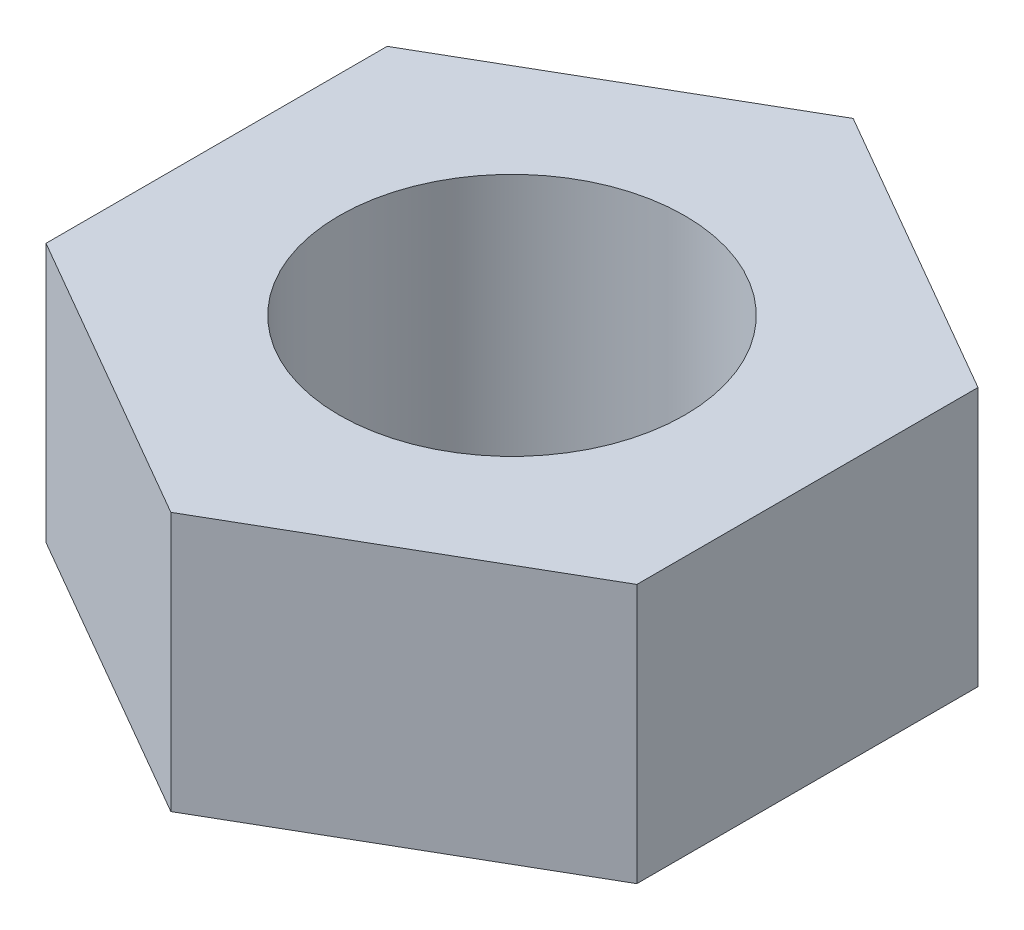
ISO-10303-21;
HEADER;
FILE_DESCRIPTION(('STEP AP214'),'2;1');
FILE_NAME('part.step','',(''),(''),'','','');
FILE_SCHEMA(('AUTOMOTIVE_DESIGN { 1 0 10303 214 1 1 1 1 }'));
ENDSEC;
DATA;
#1=APPLICATION_CONTEXT('core data for automotive mechanical design processes');
#2=APPLICATION_PROTOCOL_DEFINITION('international standard','automotive_design',2000,#1);
#3=PRODUCT_CONTEXT('',#1,'mechanical');
#4=PRODUCT('Part','Part','',(#3));
#5=PRODUCT_RELATED_PRODUCT_CATEGORY('part','',(#4));
#6=PRODUCT_DEFINITION_FORMATION('','',#4);
#7=PRODUCT_DEFINITION_CONTEXT('part definition',#1,'design');
#8=PRODUCT_DEFINITION('design','',#6,#7);
#9=PRODUCT_DEFINITION_SHAPE('','',#8);
#10=(LENGTH_UNIT() NAMED_UNIT(*) SI_UNIT(.MILLI.,.METRE.));
#11=(NAMED_UNIT(*) PLANE_ANGLE_UNIT() SI_UNIT($,.RADIAN.));
#12=(NAMED_UNIT(*) SI_UNIT($,.STERADIAN.) SOLID_ANGLE_UNIT());
#13=UNCERTAINTY_MEASURE_WITH_UNIT(LENGTH_MEASURE(1.E-05),#10,'distance_accuracy_value','');
#14=(GEOMETRIC_REPRESENTATION_CONTEXT(3) GLOBAL_UNCERTAINTY_ASSIGNED_CONTEXT((#13)) GLOBAL_UNIT_ASSIGNED_CONTEXT((#10,
#11,#12)) REPRESENTATION_CONTEXT('',''));
#15=CARTESIAN_POINT('',(0.,0.,0.));
#16=DIRECTION('',(0.,0.,1.));
#17=DIRECTION('',(1.,0.,0.));
#18=AXIS2_PLACEMENT_3D('',#15,#16,#17);
#19=CARTESIAN_POINT('',(0.,3.,0.));
#20=DIRECTION('',(0.,1.,0.));
#21=DIRECTION('',(0.,0.,1.));
#22=AXIS2_PLACEMENT_3D('',#19,#20,#21);
#23=PLANE('',#22);
#24=DIRECTION('',(0.866025403784439,0.,0.5));
#25=VECTOR('',#24,1.);
#26=CARTESIAN_POINT('',(-3.42,3.,1.97453792062852));
#27=LINE('',#26,#25);
#28=CARTESIAN_POINT('',(-3.42,3.,1.97453792062852));
#29=VERTEX_POINT('',#28);
#30=CARTESIAN_POINT('',(0.,3.,3.94907584125704));
#31=VERTEX_POINT('',#30);
#32=EDGE_CURVE('E129',#29,#31,#27,.T.);
#33=ORIENTED_EDGE('',*,*,#32,.T.);
#34=DIRECTION('',(0.866025403784439,0.,-0.5));
#35=VECTOR('',#34,1.);
#36=CARTESIAN_POINT('',(0.,3.,3.94907584125704));
#37=LINE('',#36,#35);
#38=CARTESIAN_POINT('',(3.42,3.,1.97453792062852));
#39=VERTEX_POINT('',#38);
#40=EDGE_CURVE('E87',#31,#39,#37,.T.);
#41=ORIENTED_EDGE('',*,*,#40,.T.);
#42=DIRECTION('',(0.,0.,-1.));
#43=VECTOR('',#42,1.);
#44=CARTESIAN_POINT('',(3.42,3.,1.97453792062852));
#45=LINE('',#44,#43);
#46=CARTESIAN_POINT('',(3.42,3.,-1.97453792062852));
#47=VERTEX_POINT('',#46);
#48=EDGE_CURVE('E100',#39,#47,#45,.T.);
#49=ORIENTED_EDGE('',*,*,#48,.T.);
#50=DIRECTION('',(-0.866025403784439,0.,-0.5));
#51=VECTOR('',#50,1.);
#52=CARTESIAN_POINT('',(3.42,3.,-1.97453792062852));
#53=LINE('',#52,#51);
#54=CARTESIAN_POINT('',(0.,3.,-3.94907584125704));
#55=VERTEX_POINT('',#54);
#56=EDGE_CURVE('E94',#47,#55,#53,.T.);
#57=ORIENTED_EDGE('',*,*,#56,.T.);
#58=DIRECTION('',(-0.866025403784439,0.,0.5));
#59=VECTOR('',#58,1.);
#60=CARTESIAN_POINT('',(0.,3.,-3.94907584125704));
#61=LINE('',#60,#59);
#62=CARTESIAN_POINT('',(-3.42,3.,-1.97453792062852));
#63=VERTEX_POINT('',#62);
#64=EDGE_CURVE('E98',#55,#63,#61,.T.);
#65=ORIENTED_EDGE('',*,*,#64,.T.);
#66=DIRECTION('',(0.,0.,1.));
#67=VECTOR('',#66,1.);
#68=CARTESIAN_POINT('',(-3.42,3.,-1.97453792062852));
#69=LINE('',#68,#67);
#70=EDGE_CURVE('E50',#63,#29,#69,.T.);
#71=ORIENTED_EDGE('',*,*,#70,.T.);
#72=EDGE_LOOP('',(#33,#41,#49,#57,#65,#71));
#73=FACE_BOUND('',#72,.T.);
#74=CARTESIAN_POINT('',(0.,3.,0.));
#75=DIRECTION('',(0.,1.,0.));
#76=DIRECTION('',(0.,0.,1.));
#77=AXIS2_PLACEMENT_3D('',#74,#75,#76);
#78=CIRCLE('',#77,2.);
#79=CARTESIAN_POINT('',(0.,3.,2.));
#80=VERTEX_POINT('',#79);
#81=EDGE_CURVE('E122',#80,#80,#78,.T.);
#82=ORIENTED_EDGE('',*,*,#81,.F.);
#83=EDGE_LOOP('',(#82));
#84=FACE_BOUND('',#83,.T.);
#85=ADVANCED_FACE('F33',(#73,#84),#23,.T.);
#86=CARTESIAN_POINT('',(0.,0.,0.));
#87=DIRECTION('',(0.,1.,0.));
#88=DIRECTION('',(0.,0.,1.));
#89=AXIS2_PLACEMENT_3D('',#86,#87,#88);
#90=PLANE('',#89);
#91=DIRECTION('',(0.866025403784439,0.,0.5));
#92=VECTOR('',#91,1.);
#93=CARTESIAN_POINT('',(-3.42,0.,1.97453792062852));
#94=LINE('',#93,#92);
#95=CARTESIAN_POINT('',(-3.42,0.,1.97453792062852));
#96=VERTEX_POINT('',#95);
#97=CARTESIAN_POINT('',(0.,0.,3.94907584125704));
#98=VERTEX_POINT('',#97);
#99=EDGE_CURVE('E118',#96,#98,#94,.T.);
#100=ORIENTED_EDGE('',*,*,#99,.F.);
#101=DIRECTION('',(0.,0.,1.));
#102=VECTOR('',#101,1.);
#103=CARTESIAN_POINT('',(-3.42,0.,-1.97453792062852));
#104=LINE('',#103,#102);
#105=CARTESIAN_POINT('',(-3.42,0.,-1.97453792062852));
#106=VERTEX_POINT('',#105);
#107=EDGE_CURVE('E79',#106,#96,#104,.T.);
#108=ORIENTED_EDGE('',*,*,#107,.F.);
#109=DIRECTION('',(-0.866025403784439,0.,0.5));
#110=VECTOR('',#109,1.);
#111=CARTESIAN_POINT('',(0.,0.,-3.94907584125704));
#112=LINE('',#111,#110);
#113=CARTESIAN_POINT('',(0.,0.,-3.94907584125704));
#114=VERTEX_POINT('',#113);
#115=EDGE_CURVE('E73',#114,#106,#112,.T.);
#116=ORIENTED_EDGE('',*,*,#115,.F.);
#117=DIRECTION('',(-0.866025403784439,0.,-0.5));
#118=VECTOR('',#117,1.);
#119=CARTESIAN_POINT('',(3.42,0.,-1.97453792062852));
#120=LINE('',#119,#118);
#121=CARTESIAN_POINT('',(3.42,0.,-1.97453792062852));
#122=VERTEX_POINT('',#121);
#123=EDGE_CURVE('E108',#122,#114,#120,.T.);
#124=ORIENTED_EDGE('',*,*,#123,.F.);
#125=DIRECTION('',(0.,0.,-1.));
#126=VECTOR('',#125,1.);
#127=CARTESIAN_POINT('',(3.42,0.,1.97453792062852));
#128=LINE('',#127,#126);
#129=CARTESIAN_POINT('',(3.42,0.,1.97453792062852));
#130=VERTEX_POINT('',#129);
#131=EDGE_CURVE('E124',#130,#122,#128,.T.);
#132=ORIENTED_EDGE('',*,*,#131,.F.);
#133=DIRECTION('',(0.866025403784439,0.,-0.5));
#134=VECTOR('',#133,1.);
#135=CARTESIAN_POINT('',(0.,0.,3.94907584125704));
#136=LINE('',#135,#134);
#137=EDGE_CURVE('E121',#98,#130,#136,.T.);
#138=ORIENTED_EDGE('',*,*,#137,.F.);
#139=EDGE_LOOP('',(#100,#108,#116,#124,#132,#138));
#140=FACE_BOUND('',#139,.T.);
#141=CARTESIAN_POINT('',(0.,0.,0.));
#142=DIRECTION('',(0.,1.,0.));
#143=DIRECTION('',(0.,0.,1.));
#144=AXIS2_PLACEMENT_3D('',#141,#142,#143);
#145=CIRCLE('',#144,2.);
#146=CARTESIAN_POINT('',(0.,0.,2.));
#147=VERTEX_POINT('',#146);
#148=EDGE_CURVE('E222',#147,#147,#145,.T.);
#149=ORIENTED_EDGE('',*,*,#148,.T.);
#150=EDGE_LOOP('',(#149));
#151=FACE_BOUND('',#150,.T.);
#152=ADVANCED_FACE('F138',(#140,#151),#90,.F.);
#153=CARTESIAN_POINT('',(-3.42,3.,1.97453792062852));
#154=DIRECTION('',(0.5,0.,-0.866025403784439));
#155=DIRECTION('',(-0.866025403784439,0.,-0.5));
#156=AXIS2_PLACEMENT_3D('',#153,#154,#155);
#157=PLANE('',#156);
#158=ORIENTED_EDGE('',*,*,#99,.T.);
#159=DIRECTION('',(0.,-1.,0.));
#160=VECTOR('',#159,1.);
#161=CARTESIAN_POINT('',(0.,3.,3.94907584125704));
#162=LINE('',#161,#160);
#163=EDGE_CURVE('E11',#31,#98,#162,.T.);
#164=ORIENTED_EDGE('',*,*,#163,.F.);
#165=ORIENTED_EDGE('',*,*,#32,.F.);
#166=DIRECTION('',(0.,-1.,0.));
#167=VECTOR('',#166,1.);
#168=CARTESIAN_POINT('',(-3.42,3.,1.97453792062852));
#169=LINE('',#168,#167);
#170=EDGE_CURVE('E114',#29,#96,#169,.T.);
#171=ORIENTED_EDGE('',*,*,#170,.T.);
#172=EDGE_LOOP('',(#158,#164,#165,#171));
#173=FACE_BOUND('',#172,.T.);
#174=ADVANCED_FACE('F35',(#173),#157,.F.);
#175=CARTESIAN_POINT('',(0.,3.,3.94907584125704));
#176=DIRECTION('',(-0.5,0.,-0.866025403784439));
#177=DIRECTION('',(-0.866025403784439,0.,0.5));
#178=AXIS2_PLACEMENT_3D('',#175,#176,#177);
#179=PLANE('',#178);
#180=ORIENTED_EDGE('',*,*,#137,.T.);
#181=DIRECTION('',(0.,-1.,0.));
#182=VECTOR('',#181,1.);
#183=CARTESIAN_POINT('',(3.42,3.,1.97453792062852));
#184=LINE('',#183,#182);
#185=EDGE_CURVE('E42',#39,#130,#184,.T.);
#186=ORIENTED_EDGE('',*,*,#185,.F.);
#187=ORIENTED_EDGE('',*,*,#40,.F.);
#188=ORIENTED_EDGE('',*,*,#163,.T.);
#189=EDGE_LOOP('',(#180,#186,#187,#188));
#190=FACE_BOUND('',#189,.T.);
#191=ADVANCED_FACE('F163',(#190),#179,.F.);
#192=CARTESIAN_POINT('',(3.42,3.,1.97453792062852));
#193=DIRECTION('',(-1.,0.,0.));
#194=DIRECTION('',(0.,0.,1.));
#195=AXIS2_PLACEMENT_3D('',#192,#193,#194);
#196=PLANE('',#195);
#197=ORIENTED_EDGE('',*,*,#131,.T.);
#198=DIRECTION('',(0.,-1.,0.));
#199=VECTOR('',#198,1.);
#200=CARTESIAN_POINT('',(3.42,3.,-1.97453792062852));
#201=LINE('',#200,#199);
#202=EDGE_CURVE('E109',#47,#122,#201,.T.);
#203=ORIENTED_EDGE('',*,*,#202,.F.);
#204=ORIENTED_EDGE('',*,*,#48,.F.);
#205=ORIENTED_EDGE('',*,*,#185,.T.);
#206=EDGE_LOOP('',(#197,#203,#204,#205));
#207=FACE_BOUND('',#206,.T.);
#208=ADVANCED_FACE('F135',(#207),#196,.F.);
#209=CARTESIAN_POINT('',(3.42,3.,-1.97453792062852));
#210=DIRECTION('',(-0.5,0.,0.866025403784439));
#211=DIRECTION('',(0.866025403784439,0.,0.5));
#212=AXIS2_PLACEMENT_3D('',#209,#210,#211);
#213=PLANE('',#212);
#214=ORIENTED_EDGE('',*,*,#123,.T.);
#215=DIRECTION('',(0.,-1.,0.));
#216=VECTOR('',#215,1.);
#217=CARTESIAN_POINT('',(0.,3.,-3.94907584125704));
#218=LINE('',#217,#216);
#219=EDGE_CURVE('E105',#55,#114,#218,.T.);
#220=ORIENTED_EDGE('',*,*,#219,.F.);
#221=ORIENTED_EDGE('',*,*,#56,.F.);
#222=ORIENTED_EDGE('',*,*,#202,.T.);
#223=EDGE_LOOP('',(#214,#220,#221,#222));
#224=FACE_BOUND('',#223,.T.);
#225=ADVANCED_FACE('F106',(#224),#213,.F.);
#226=CARTESIAN_POINT('',(0.,3.,-3.94907584125704));
#227=DIRECTION('',(0.5,0.,0.866025403784439));
#228=DIRECTION('',(0.866025403784439,0.,-0.5));
#229=AXIS2_PLACEMENT_3D('',#226,#227,#228);
#230=PLANE('',#229);
#231=ORIENTED_EDGE('',*,*,#115,.T.);
#232=DIRECTION('',(0.,-1.,0.));
#233=VECTOR('',#232,1.);
#234=CARTESIAN_POINT('',(-3.42,3.,-1.97453792062852));
#235=LINE('',#234,#233);
#236=EDGE_CURVE('E110',#63,#106,#235,.T.);
#237=ORIENTED_EDGE('',*,*,#236,.F.);
#238=ORIENTED_EDGE('',*,*,#64,.F.);
#239=ORIENTED_EDGE('',*,*,#219,.T.);
#240=EDGE_LOOP('',(#231,#237,#238,#239));
#241=FACE_BOUND('',#240,.T.);
#242=ADVANCED_FACE('F112',(#241),#230,.F.);
#243=CARTESIAN_POINT('',(-3.42,3.,-1.97453792062852));
#244=DIRECTION('',(1.,0.,0.));
#245=DIRECTION('',(0.,0.,-1.));
#246=AXIS2_PLACEMENT_3D('',#243,#244,#245);
#247=PLANE('',#246);
#248=ORIENTED_EDGE('',*,*,#107,.T.);
#249=ORIENTED_EDGE('',*,*,#170,.F.);
#250=ORIENTED_EDGE('',*,*,#70,.F.);
#251=ORIENTED_EDGE('',*,*,#236,.T.);
#252=EDGE_LOOP('',(#248,#249,#250,#251));
#253=FACE_BOUND('',#252,.T.);
#254=ADVANCED_FACE('F143',(#253),#247,.F.);
#255=CARTESIAN_POINT('',(0.,3.,0.));
#256=DIRECTION('',(0.,-1.,0.));
#257=DIRECTION('',(0.,0.,-1.));
#258=AXIS2_PLACEMENT_3D('',#255,#256,#257);
#259=CYLINDRICAL_SURFACE('',#258,2.);
#260=ORIENTED_EDGE('',*,*,#81,.T.);
#261=EDGE_LOOP('',(#260));
#262=FACE_BOUND('',#261,.T.);
#263=ORIENTED_EDGE('',*,*,#148,.F.);
#264=EDGE_LOOP('',(#263));
#265=FACE_BOUND('',#264,.T.);
#266=ADVANCED_FACE('F145',(#262,#265),#259,.F.);
#267=CLOSED_SHELL('',(#85,#152,#174,#191,#208,#225,#242,#254,#266));
#268=MANIFOLD_SOLID_BREP('B2',#267);
#269=ADVANCED_BREP_SHAPE_REPRESENTATION('',(#18,#268),#14);
#270=SHAPE_DEFINITION_REPRESENTATION(#9,#269);
ENDSEC;
END-ISO-10303-21;
